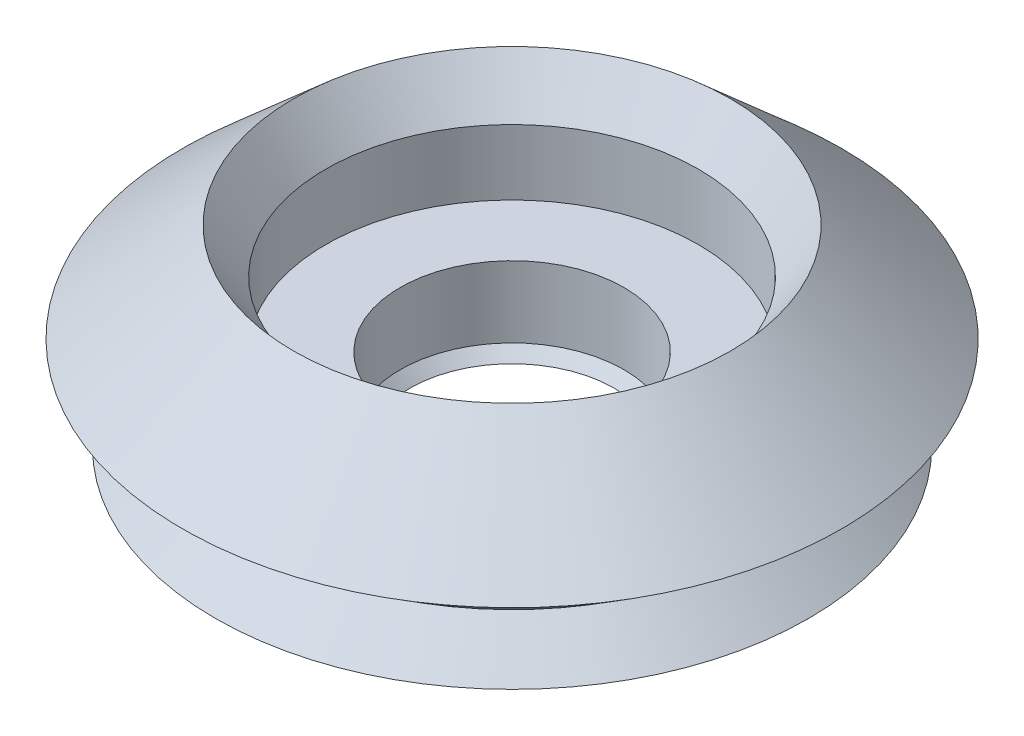
ISO-10303-21;
HEADER;
FILE_DESCRIPTION(('STEP AP214'),'2;1');
FILE_NAME('part.step','',(''),(''),'','','');
FILE_SCHEMA(('AUTOMOTIVE_DESIGN { 1 0 10303 214 1 1 1 1 }'));
ENDSEC;
DATA;
#1=APPLICATION_CONTEXT('core data for automotive mechanical design processes');
#2=APPLICATION_PROTOCOL_DEFINITION('international standard','automotive_design',2000,#1);
#3=PRODUCT_CONTEXT('',#1,'mechanical');
#4=PRODUCT('Part','Part','',(#3));
#5=PRODUCT_RELATED_PRODUCT_CATEGORY('part','',(#4));
#6=PRODUCT_DEFINITION_FORMATION('','',#4);
#7=PRODUCT_DEFINITION_CONTEXT('part definition',#1,'design');
#8=PRODUCT_DEFINITION('design','',#6,#7);
#9=PRODUCT_DEFINITION_SHAPE('','',#8);
#10=(LENGTH_UNIT() NAMED_UNIT(*) SI_UNIT(.MILLI.,.METRE.));
#11=(NAMED_UNIT(*) PLANE_ANGLE_UNIT() SI_UNIT($,.RADIAN.));
#12=(NAMED_UNIT(*) SI_UNIT($,.STERADIAN.) SOLID_ANGLE_UNIT());
#13=UNCERTAINTY_MEASURE_WITH_UNIT(LENGTH_MEASURE(1.E-05),#10,'distance_accuracy_value','');
#14=(GEOMETRIC_REPRESENTATION_CONTEXT(3) GLOBAL_UNCERTAINTY_ASSIGNED_CONTEXT((#13)) GLOBAL_UNIT_ASSIGNED_CONTEXT((#10,
#11,#12)) REPRESENTATION_CONTEXT('',''));
#15=CARTESIAN_POINT('',(0.,0.,0.));
#16=DIRECTION('',(0.,0.,1.));
#17=DIRECTION('',(1.,0.,0.));
#18=AXIS2_PLACEMENT_3D('',#15,#16,#17);
#19=CARTESIAN_POINT('',(0.,-2.06427532266893,0.));
#20=DIRECTION('',(0.,1.,0.));
#21=DIRECTION('',(0.,0.,1.));
#22=AXIS2_PLACEMENT_3D('',#19,#20,#21);
#23=CONICAL_SURFACE('',#22,19.0126360092104,0.726545236043027);
#24=CARTESIAN_POINT('',(0.,0.,0.));
#25=DIRECTION('',(0.,-1.,0.));
#26=DIRECTION('',(0.,0.,-1.));
#27=AXIS2_PLACEMENT_3D('',#24,#25,#26);
#28=CIRCLE('',#27,20.8471886065904);
#29=CARTESIAN_POINT('',(0.,0.,-20.8471886065904));
#30=VERTEX_POINT('',#29);
#31=EDGE_CURVE('E10',#30,#30,#28,.T.);
#32=ORIENTED_EDGE('',*,*,#31,.F.);
#33=EDGE_LOOP('',(#32));
#34=FACE_BOUND('',#33,.T.);
#35=CARTESIAN_POINT('',(0.,-2.06427532266893,0.));
#36=DIRECTION('',(0.,-1.,0.));
#37=DIRECTION('',(0.,0.,-1.));
#38=AXIS2_PLACEMENT_3D('',#35,#36,#37);
#39=CIRCLE('',#38,19.0126360092104);
#40=CARTESIAN_POINT('',(0.,-2.06427532266893,-19.0126360092104));
#41=VERTEX_POINT('',#40);
#42=EDGE_CURVE('E62',#41,#41,#39,.T.);
#43=ORIENTED_EDGE('',*,*,#42,.T.);
#44=EDGE_LOOP('',(#43));
#45=FACE_BOUND('',#44,.T.);
#46=ADVANCED_FACE('F31',(#34,#45),#23,.F.);
#47=CARTESIAN_POINT('',(0.,0.,0.));
#48=DIRECTION('',(0.,-1.,0.));
#49=DIRECTION('',(0.,0.,-1.));
#50=AXIS2_PLACEMENT_3D('',#47,#48,#49);
#51=CYLINDRICAL_SURFACE('',#50,20.8471886065904);
#52=CARTESIAN_POINT('',(0.,13.2588119537915,0.));
#53=DIRECTION('',(0.,-1.,0.));
#54=DIRECTION('',(0.,0.,-1.));
#55=AXIS2_PLACEMENT_3D('',#52,#53,#54);
#56=CIRCLE('',#55,20.8471886065904);
#57=CARTESIAN_POINT('',(0.,13.2588119537915,-20.8471886065904));
#58=VERTEX_POINT('',#57);
#59=EDGE_CURVE('E37',#58,#58,#56,.T.);
#60=ORIENTED_EDGE('',*,*,#59,.F.);
#61=EDGE_LOOP('',(#60));
#62=FACE_BOUND('',#61,.T.);
#63=ORIENTED_EDGE('',*,*,#31,.T.);
#64=EDGE_LOOP('',(#63));
#65=FACE_BOUND('',#64,.T.);
#66=ADVANCED_FACE('F105',(#62,#65),#51,.F.);
#67=CARTESIAN_POINT('',(-20.8471886065904,13.2588119537915,0.));
#68=DIRECTION('',(0.,-1.,0.));
#69=DIRECTION('',(0.,0.,-1.));
#70=AXIS2_PLACEMENT_3D('',#67,#68,#69);
#71=PLANE('',#70);
#72=CARTESIAN_POINT('',(0.,13.2588119537915,0.));
#73=DIRECTION('',(0.,-1.,0.));
#74=DIRECTION('',(0.,0.,-1.));
#75=AXIS2_PLACEMENT_3D('',#72,#73,#74);
#76=CIRCLE('',#75,34.6897218413664);
#77=CARTESIAN_POINT('',(0.,13.2588119537915,-34.6897218413664));
#78=VERTEX_POINT('',#77);
#79=EDGE_CURVE('E41',#78,#78,#76,.T.);
#80=ORIENTED_EDGE('',*,*,#79,.F.);
#81=EDGE_LOOP('',(#80));
#82=FACE_BOUND('',#81,.T.);
#83=ORIENTED_EDGE('',*,*,#59,.T.);
#84=EDGE_LOOP('',(#83));
#85=FACE_BOUND('',#84,.T.);
#86=ADVANCED_FACE('F100',(#82,#85),#71,.F.);
#87=CARTESIAN_POINT('',(0.,0.,0.));
#88=DIRECTION('',(0.,-1.,0.));
#89=DIRECTION('',(0.,0.,-1.));
#90=AXIS2_PLACEMENT_3D('',#87,#88,#89);
#91=CYLINDRICAL_SURFACE('',#90,34.6897218413664);
#92=CARTESIAN_POINT('',(0.,25.4335701000402,0.));
#93=DIRECTION('',(0.,-1.,0.));
#94=DIRECTION('',(0.,0.,-1.));
#95=AXIS2_PLACEMENT_3D('',#92,#93,#94);
#96=CIRCLE('',#95,34.6897218413664);
#97=CARTESIAN_POINT('',(0.,25.4335701000402,-34.6897218413664));
#98=VERTEX_POINT('',#97);
#99=EDGE_CURVE('E45',#98,#98,#96,.T.);
#100=ORIENTED_EDGE('',*,*,#99,.F.);
#101=EDGE_LOOP('',(#100));
#102=FACE_BOUND('',#101,.T.);
#103=ORIENTED_EDGE('',*,*,#79,.T.);
#104=EDGE_LOOP('',(#103));
#105=FACE_BOUND('',#104,.T.);
#106=ADVANCED_FACE('F94',(#102,#105),#91,.F.);
#107=CARTESIAN_POINT('',(0.,25.4335701000402,0.));
#108=DIRECTION('',(0.,1.,0.));
#109=DIRECTION('',(0.,0.,1.));
#110=AXIS2_PLACEMENT_3D('',#107,#108,#109);
#111=CONICAL_SURFACE('',#110,34.6897218413664,0.624023052976757);
#112=CARTESIAN_POINT('',(0.,33.7724455426764,0.));
#113=DIRECTION('',(0.,-1.,0.));
#114=DIRECTION('',(0.,0.,-1.));
#115=AXIS2_PLACEMENT_3D('',#112,#113,#114);
#116=CIRCLE('',#115,40.6937121600644);
#117=CARTESIAN_POINT('',(0.,33.7724455426764,-40.6937121600644));
#118=VERTEX_POINT('',#117);
#119=EDGE_CURVE('E50',#118,#118,#116,.T.);
#120=ORIENTED_EDGE('',*,*,#119,.F.);
#121=EDGE_LOOP('',(#120));
#122=FACE_BOUND('',#121,.T.);
#123=ORIENTED_EDGE('',*,*,#99,.T.);
#124=EDGE_LOOP('',(#123));
#125=FACE_BOUND('',#124,.T.);
#126=ADVANCED_FACE('F88',(#122,#125),#111,.F.);
#127=CARTESIAN_POINT('',(0.,33.7724455426764,0.));
#128=DIRECTION('',(0.,-1.,0.));
#129=DIRECTION('',(0.,0.,-1.));
#130=AXIS2_PLACEMENT_3D('',#127,#128,#129);
#131=CONICAL_SURFACE('',#130,40.6937121600644,0.845155989785846);
#132=CARTESIAN_POINT('',(0.,15.4269195688769,0.));
#133=DIRECTION('',(0.,-1.,0.));
#134=DIRECTION('',(0.,0.,-1.));
#135=AXIS2_PLACEMENT_3D('',#132,#133,#134);
#136=CIRCLE('',#135,61.374123257802);
#137=CARTESIAN_POINT('',(0.,15.4269195688769,-61.374123257802));
#138=VERTEX_POINT('',#137);
#139=EDGE_CURVE('E53',#138,#138,#136,.T.);
#140=ORIENTED_EDGE('',*,*,#139,.F.);
#141=EDGE_LOOP('',(#140));
#142=FACE_BOUND('',#141,.T.);
#143=ORIENTED_EDGE('',*,*,#119,.T.);
#144=EDGE_LOOP('',(#143));
#145=FACE_BOUND('',#144,.T.);
#146=ADVANCED_FACE('F82',(#142,#145),#131,.T.);
#147=CARTESIAN_POINT('',(0.,15.4269195688769,0.));
#148=DIRECTION('',(0.,1.,0.));
#149=DIRECTION('',(0.,0.,1.));
#150=AXIS2_PLACEMENT_3D('',#147,#148,#149);
#151=CONICAL_SURFACE('',#150,61.374123257802,0.940602417250347);
#152=CARTESIAN_POINT('',(0.,5.08671402000806,0.));
#153=DIRECTION('',(0.,-1.,0.));
#154=DIRECTION('',(0.,0.,-1.));
#155=AXIS2_PLACEMENT_3D('',#152,#153,#154);
#156=CIRCLE('',#155,47.1980350053206);
#157=CARTESIAN_POINT('',(0.,5.08671402000806,-47.1980350053206));
#158=VERTEX_POINT('',#157);
#159=EDGE_CURVE('E56',#158,#158,#156,.T.);
#160=ORIENTED_EDGE('',*,*,#159,.F.);
#161=EDGE_LOOP('',(#160));
#162=FACE_BOUND('',#161,.T.);
#163=ORIENTED_EDGE('',*,*,#139,.T.);
#164=EDGE_LOOP('',(#163));
#165=FACE_BOUND('',#164,.T.);
#166=ADVANCED_FACE('F76',(#162,#165),#151,.T.);
#167=CARTESIAN_POINT('',(0.,5.08671402000806,0.));
#168=DIRECTION('',(0.,-1.,0.));
#169=DIRECTION('',(0.,0.,-1.));
#170=AXIS2_PLACEMENT_3D('',#167,#168,#169);
#171=CONICAL_SURFACE('',#170,47.1980350053206,0.845155989785845);
#172=CARTESIAN_POINT('',(0.,-2.06427532266893,0.));
#173=DIRECTION('',(0.,-1.,0.));
#174=DIRECTION('',(0.,0.,-1.));
#175=AXIS2_PLACEMENT_3D('',#172,#173,#174);
#176=CIRCLE('',#175,55.2591502643383);
#177=CARTESIAN_POINT('',(0.,-2.06427532266893,-55.2591502643383));
#178=VERTEX_POINT('',#177);
#179=EDGE_CURVE('E59',#178,#178,#176,.T.);
#180=ORIENTED_EDGE('',*,*,#179,.F.);
#181=EDGE_LOOP('',(#180));
#182=FACE_BOUND('',#181,.T.);
#183=ORIENTED_EDGE('',*,*,#159,.T.);
#184=EDGE_LOOP('',(#183));
#185=FACE_BOUND('',#184,.T.);
#186=ADVANCED_FACE('F70',(#182,#185),#171,.T.);
#187=CARTESIAN_POINT('',(-55.2591502643383,-2.06427532266893,0.));
#188=DIRECTION('',(0.,1.,0.));
#189=DIRECTION('',(0.,0.,1.));
#190=AXIS2_PLACEMENT_3D('',#187,#188,#189);
#191=PLANE('',#190);
#192=ORIENTED_EDGE('',*,*,#42,.F.);
#193=EDGE_LOOP('',(#192));
#194=FACE_BOUND('',#193,.T.);
#195=ORIENTED_EDGE('',*,*,#179,.T.);
#196=EDGE_LOOP('',(#195));
#197=FACE_BOUND('',#196,.T.);
#198=ADVANCED_FACE('F67',(#194,#197),#191,.F.);
#199=CLOSED_SHELL('',(#46,#66,#86,#106,#126,#146,#166,#186,#198));
#200=MANIFOLD_SOLID_BREP('B2',#199);
#201=ADVANCED_BREP_SHAPE_REPRESENTATION('',(#18,#200),#14);
#202=SHAPE_DEFINITION_REPRESENTATION(#9,#201);
ENDSEC;
END-ISO-10303-21;
